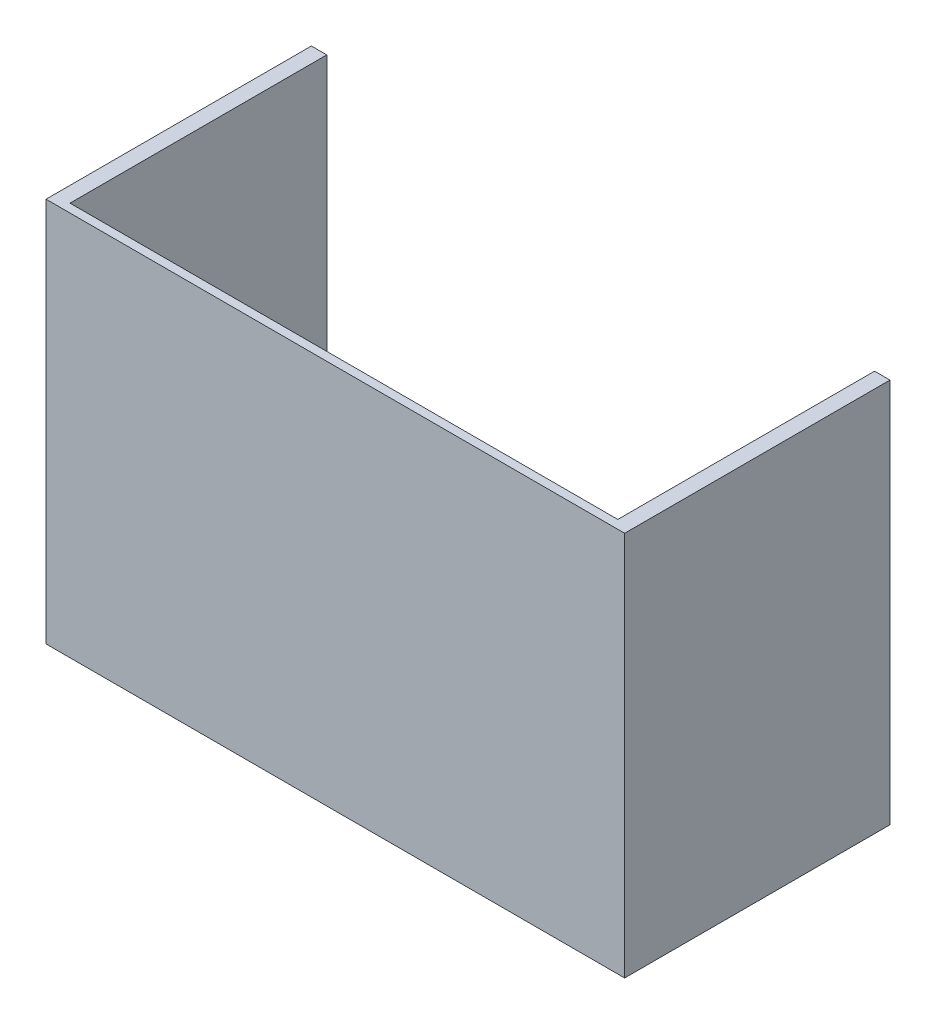
ISO-10303-21;
HEADER;
FILE_DESCRIPTION(('STEP AP214'),'2;1');
FILE_NAME('part.step','',(''),(''),'','','');
FILE_SCHEMA(('AUTOMOTIVE_DESIGN { 1 0 10303 214 1 1 1 1 }'));
ENDSEC;
DATA;
#1=APPLICATION_CONTEXT('core data for automotive mechanical design processes');
#2=APPLICATION_PROTOCOL_DEFINITION('international standard','automotive_design',2000,#1);
#3=PRODUCT_CONTEXT('',#1,'mechanical');
#4=PRODUCT('Part','Part','',(#3));
#5=PRODUCT_RELATED_PRODUCT_CATEGORY('part','',(#4));
#6=PRODUCT_DEFINITION_FORMATION('','',#4);
#7=PRODUCT_DEFINITION_CONTEXT('part definition',#1,'design');
#8=PRODUCT_DEFINITION('design','',#6,#7);
#9=PRODUCT_DEFINITION_SHAPE('','',#8);
#10=(LENGTH_UNIT() NAMED_UNIT(*) SI_UNIT(.MILLI.,.METRE.));
#11=(NAMED_UNIT(*) PLANE_ANGLE_UNIT() SI_UNIT($,.RADIAN.));
#12=(NAMED_UNIT(*) SI_UNIT($,.STERADIAN.) SOLID_ANGLE_UNIT());
#13=UNCERTAINTY_MEASURE_WITH_UNIT(LENGTH_MEASURE(1.E-05),#10,'distance_accuracy_value','');
#14=(GEOMETRIC_REPRESENTATION_CONTEXT(3) GLOBAL_UNCERTAINTY_ASSIGNED_CONTEXT((#13)) GLOBAL_UNIT_ASSIGNED_CONTEXT((#10,
#11,#12)) REPRESENTATION_CONTEXT('',''));
#15=CARTESIAN_POINT('',(0.,0.,0.));
#16=DIRECTION('',(0.,0.,1.));
#17=DIRECTION('',(1.,0.,0.));
#18=AXIS2_PLACEMENT_3D('',#15,#16,#17);
#19=CARTESIAN_POINT('',(-195.2,35.6309204037054,12.9999999999999));
#20=DIRECTION('',(-1.,0.,0.));
#21=DIRECTION('',(0.,-1.,0.));
#22=AXIS2_PLACEMENT_3D('',#19,#20,#21);
#23=PLANE('',#22);
#24=DIRECTION('',(0.,0.,1.));
#25=VECTOR('',#24,1.);
#26=CARTESIAN_POINT('',(-195.2,110.,12.9999999999998));
#27=LINE('',#26,#25);
#28=CARTESIAN_POINT('',(-195.2,110.,12.9999999999998));
#29=VERTEX_POINT('',#28);
#30=CARTESIAN_POINT('',(-195.2,110.,43.9999999999998));
#31=VERTEX_POINT('',#30);
#32=EDGE_CURVE('E35',#29,#31,#27,.T.);
#33=ORIENTED_EDGE('',*,*,#32,.F.);
#34=DIRECTION('',(0.,1.,0.));
#35=VECTOR('',#34,1.);
#36=CARTESIAN_POINT('',(-195.2,35.6309204037054,12.9999999999999));
#37=LINE('',#36,#35);
#38=CARTESIAN_POINT('',(-195.2,155.,12.9999999999998));
#39=VERTEX_POINT('',#38);
#40=EDGE_CURVE('E116',#29,#39,#37,.T.);
#41=ORIENTED_EDGE('',*,*,#40,.T.);
#42=DIRECTION('',(0.,0.,1.));
#43=VECTOR('',#42,1.);
#44=CARTESIAN_POINT('',(-195.2,155.,12.9999999999998));
#45=LINE('',#44,#43);
#46=CARTESIAN_POINT('',(-195.2,155.,43.9999999999998));
#47=VERTEX_POINT('',#46);
#48=EDGE_CURVE('E110',#39,#47,#45,.T.);
#49=ORIENTED_EDGE('',*,*,#48,.T.);
#50=DIRECTION('',(0.,1.,0.));
#51=VECTOR('',#50,1.);
#52=CARTESIAN_POINT('',(-195.2,35.6309204037054,43.9999999999999));
#53=LINE('',#52,#51);
#54=EDGE_CURVE('E95',#31,#47,#53,.T.);
#55=ORIENTED_EDGE('',*,*,#54,.F.);
#56=EDGE_LOOP('',(#33,#41,#49,#55));
#57=FACE_BOUND('',#56,.T.);
#58=ADVANCED_FACE('F32',(#57),#23,.F.);
#59=CARTESIAN_POINT('',(-195.2,35.6309204037054,43.9999999999999));
#60=DIRECTION('',(0.,0.,-1.));
#61=DIRECTION('',(0.,1.,0.));
#62=AXIS2_PLACEMENT_3D('',#59,#60,#61);
#63=PLANE('',#62);
#64=DIRECTION('',(-1.,0.,0.));
#65=VECTOR('',#64,1.);
#66=CARTESIAN_POINT('',(-195.2,110.,43.9999999999999));
#67=LINE('',#66,#65);
#68=CARTESIAN_POINT('',(-262.8,110.,43.9999999999998));
#69=VERTEX_POINT('',#68);
#70=EDGE_CURVE('E58',#31,#69,#67,.T.);
#71=ORIENTED_EDGE('',*,*,#70,.F.);
#72=ORIENTED_EDGE('',*,*,#54,.T.);
#73=DIRECTION('',(-1.,0.,0.));
#74=VECTOR('',#73,1.);
#75=CARTESIAN_POINT('',(-195.2,155.,43.9999999999998));
#76=LINE('',#75,#74);
#77=CARTESIAN_POINT('',(-262.8,155.,43.9999999999998));
#78=VERTEX_POINT('',#77);
#79=EDGE_CURVE('E99',#47,#78,#76,.T.);
#80=ORIENTED_EDGE('',*,*,#79,.T.);
#81=DIRECTION('',(0.,1.,0.));
#82=VECTOR('',#81,1.);
#83=CARTESIAN_POINT('',(-262.8,35.6309204037054,43.9999999999999));
#84=LINE('',#83,#82);
#85=EDGE_CURVE('E104',#69,#78,#84,.T.);
#86=ORIENTED_EDGE('',*,*,#85,.F.);
#87=EDGE_LOOP('',(#71,#72,#80,#86));
#88=FACE_BOUND('',#87,.T.);
#89=ADVANCED_FACE('F97',(#88),#63,.F.);
#90=CARTESIAN_POINT('',(-262.8,35.6309204037053,12.9999999999999));
#91=DIRECTION('',(1.,0.,0.));
#92=DIRECTION('',(0.,1.,0.));
#93=AXIS2_PLACEMENT_3D('',#90,#91,#92);
#94=PLANE('',#93);
#95=DIRECTION('',(0.,0.,-1.));
#96=VECTOR('',#95,1.);
#97=CARTESIAN_POINT('',(-262.8,110.,12.9999999999998));
#98=LINE('',#97,#96);
#99=CARTESIAN_POINT('',(-262.8,110.,12.9999999999998));
#100=VERTEX_POINT('',#99);
#101=EDGE_CURVE('E154',#69,#100,#98,.T.);
#102=ORIENTED_EDGE('',*,*,#101,.F.);
#103=ORIENTED_EDGE('',*,*,#85,.T.);
#104=DIRECTION('',(0.,0.,-1.));
#105=VECTOR('',#104,1.);
#106=CARTESIAN_POINT('',(-262.8,155.,12.9999999999998));
#107=LINE('',#106,#105);
#108=CARTESIAN_POINT('',(-262.8,155.,12.9999999999998));
#109=VERTEX_POINT('',#108);
#110=EDGE_CURVE('E113',#78,#109,#107,.T.);
#111=ORIENTED_EDGE('',*,*,#110,.T.);
#112=DIRECTION('',(0.,1.,0.));
#113=VECTOR('',#112,1.);
#114=CARTESIAN_POINT('',(-262.8,35.6309204037053,12.9999999999999));
#115=LINE('',#114,#113);
#116=EDGE_CURVE('E144',#100,#109,#115,.T.);
#117=ORIENTED_EDGE('',*,*,#116,.F.);
#118=EDGE_LOOP('',(#102,#103,#111,#117));
#119=FACE_BOUND('',#118,.T.);
#120=ADVANCED_FACE('F161',(#119),#94,.F.);
#121=CARTESIAN_POINT('',(-261.,35.6309204037053,12.9999999999999));
#122=DIRECTION('',(0.,0.,1.));
#123=DIRECTION('',(1.,0.,0.));
#124=AXIS2_PLACEMENT_3D('',#121,#122,#123);
#125=PLANE('',#124);
#126=DIRECTION('',(1.,0.,0.));
#127=VECTOR('',#126,1.);
#128=CARTESIAN_POINT('',(-261.,110.,12.9999999999999));
#129=LINE('',#128,#127);
#130=CARTESIAN_POINT('',(-261.,110.,12.9999999999998));
#131=VERTEX_POINT('',#130);
#132=EDGE_CURVE('E48',#100,#131,#129,.T.);
#133=ORIENTED_EDGE('',*,*,#132,.F.);
#134=ORIENTED_EDGE('',*,*,#116,.T.);
#135=DIRECTION('',(1.,0.,0.));
#136=VECTOR('',#135,1.);
#137=CARTESIAN_POINT('',(-261.,155.,12.9999999999998));
#138=LINE('',#137,#136);
#139=CARTESIAN_POINT('',(-261.,155.,12.9999999999998));
#140=VERTEX_POINT('',#139);
#141=EDGE_CURVE('E121',#109,#140,#138,.T.);
#142=ORIENTED_EDGE('',*,*,#141,.T.);
#143=DIRECTION('',(0.,1.,0.));
#144=VECTOR('',#143,1.);
#145=CARTESIAN_POINT('',(-261.,35.6309204037053,12.9999999999999));
#146=LINE('',#145,#144);
#147=EDGE_CURVE('E142',#131,#140,#146,.T.);
#148=ORIENTED_EDGE('',*,*,#147,.F.);
#149=EDGE_LOOP('',(#133,#134,#142,#148));
#150=FACE_BOUND('',#149,.T.);
#151=ADVANCED_FACE('F160',(#150),#125,.F.);
#152=CARTESIAN_POINT('',(-261.,35.6309204037053,12.9999999999999));
#153=DIRECTION('',(-1.,0.,0.));
#154=DIRECTION('',(0.,-1.,0.));
#155=AXIS2_PLACEMENT_3D('',#152,#153,#154);
#156=PLANE('',#155);
#157=DIRECTION('',(0.,0.,1.));
#158=VECTOR('',#157,1.);
#159=CARTESIAN_POINT('',(-261.,110.,12.9999999999998));
#160=LINE('',#159,#158);
#161=CARTESIAN_POINT('',(-261.,110.,42.9999999999998));
#162=VERTEX_POINT('',#161);
#163=EDGE_CURVE('E151',#131,#162,#160,.T.);
#164=ORIENTED_EDGE('',*,*,#163,.F.);
#165=ORIENTED_EDGE('',*,*,#147,.T.);
#166=DIRECTION('',(0.,0.,1.));
#167=VECTOR('',#166,1.);
#168=CARTESIAN_POINT('',(-261.,155.,12.9999999999998));
#169=LINE('',#168,#167);
#170=CARTESIAN_POINT('',(-261.,155.,42.9999999999998));
#171=VERTEX_POINT('',#170);
#172=EDGE_CURVE('E124',#140,#171,#169,.T.);
#173=ORIENTED_EDGE('',*,*,#172,.T.);
#174=DIRECTION('',(0.,1.,0.));
#175=VECTOR('',#174,1.);
#176=CARTESIAN_POINT('',(-261.,35.6309204037054,42.9999999999999));
#177=LINE('',#176,#175);
#178=EDGE_CURVE('E140',#162,#171,#177,.T.);
#179=ORIENTED_EDGE('',*,*,#178,.F.);
#180=EDGE_LOOP('',(#164,#165,#173,#179));
#181=FACE_BOUND('',#180,.T.);
#182=ADVANCED_FACE('F167',(#181),#156,.F.);
#183=CARTESIAN_POINT('',(-197.,35.6309204037054,42.9999999999999));
#184=DIRECTION('',(0.,0.,1.));
#185=DIRECTION('',(0.,-1.,0.));
#186=AXIS2_PLACEMENT_3D('',#183,#184,#185);
#187=PLANE('',#186);
#188=DIRECTION('',(1.,0.,0.));
#189=VECTOR('',#188,1.);
#190=CARTESIAN_POINT('',(-197.,110.,42.9999999999999));
#191=LINE('',#190,#189);
#192=CARTESIAN_POINT('',(-197.,110.,42.9999999999998));
#193=VERTEX_POINT('',#192);
#194=EDGE_CURVE('E148',#162,#193,#191,.T.);
#195=ORIENTED_EDGE('',*,*,#194,.F.);
#196=ORIENTED_EDGE('',*,*,#178,.T.);
#197=DIRECTION('',(1.,0.,0.));
#198=VECTOR('',#197,1.);
#199=CARTESIAN_POINT('',(-197.,155.,42.9999999999998));
#200=LINE('',#199,#198);
#201=CARTESIAN_POINT('',(-197.,155.,42.9999999999998));
#202=VERTEX_POINT('',#201);
#203=EDGE_CURVE('E127',#171,#202,#200,.T.);
#204=ORIENTED_EDGE('',*,*,#203,.T.);
#205=DIRECTION('',(0.,1.,0.));
#206=VECTOR('',#205,1.);
#207=CARTESIAN_POINT('',(-197.,35.6309204037054,42.9999999999999));
#208=LINE('',#207,#206);
#209=EDGE_CURVE('E138',#193,#202,#208,.T.);
#210=ORIENTED_EDGE('',*,*,#209,.F.);
#211=EDGE_LOOP('',(#195,#196,#204,#210));
#212=FACE_BOUND('',#211,.T.);
#213=ADVANCED_FACE('F172',(#212),#187,.F.);
#214=CARTESIAN_POINT('',(-197.,35.6309204037054,12.9999999999999));
#215=DIRECTION('',(1.,0.,0.));
#216=DIRECTION('',(0.,1.,0.));
#217=AXIS2_PLACEMENT_3D('',#214,#215,#216);
#218=PLANE('',#217);
#219=DIRECTION('',(0.,0.,-1.));
#220=VECTOR('',#219,1.);
#221=CARTESIAN_POINT('',(-197.,110.,12.9999999999998));
#222=LINE('',#221,#220);
#223=CARTESIAN_POINT('',(-197.,110.,12.9999999999999));
#224=VERTEX_POINT('',#223);
#225=EDGE_CURVE('E103',#193,#224,#222,.T.);
#226=ORIENTED_EDGE('',*,*,#225,.F.);
#227=ORIENTED_EDGE('',*,*,#209,.T.);
#228=DIRECTION('',(0.,0.,-1.));
#229=VECTOR('',#228,1.);
#230=CARTESIAN_POINT('',(-197.,155.,12.9999999999998));
#231=LINE('',#230,#229);
#232=CARTESIAN_POINT('',(-197.,155.,12.9999999999998));
#233=VERTEX_POINT('',#232);
#234=EDGE_CURVE('E130',#202,#233,#231,.T.);
#235=ORIENTED_EDGE('',*,*,#234,.T.);
#236=DIRECTION('',(0.,1.,0.));
#237=VECTOR('',#236,1.);
#238=CARTESIAN_POINT('',(-197.,35.6309204037054,12.9999999999999));
#239=LINE('',#238,#237);
#240=EDGE_CURVE('E136',#224,#233,#239,.T.);
#241=ORIENTED_EDGE('',*,*,#240,.F.);
#242=EDGE_LOOP('',(#226,#227,#235,#241));
#243=FACE_BOUND('',#242,.T.);
#244=ADVANCED_FACE('F174',(#243),#218,.F.);
#245=CARTESIAN_POINT('',(-195.2,35.6309204037054,12.9999999999999));
#246=DIRECTION('',(0.,0.,1.));
#247=DIRECTION('',(0.,-1.,0.));
#248=AXIS2_PLACEMENT_3D('',#245,#246,#247);
#249=PLANE('',#248);
#250=DIRECTION('',(1.,0.,0.));
#251=VECTOR('',#250,1.);
#252=CARTESIAN_POINT('',(-195.2,110.,12.9999999999999));
#253=LINE('',#252,#251);
#254=EDGE_CURVE('E11',#224,#29,#253,.T.);
#255=ORIENTED_EDGE('',*,*,#254,.F.);
#256=ORIENTED_EDGE('',*,*,#240,.T.);
#257=DIRECTION('',(1.,0.,0.));
#258=VECTOR('',#257,1.);
#259=CARTESIAN_POINT('',(-195.2,155.,12.9999999999998));
#260=LINE('',#259,#258);
#261=EDGE_CURVE('E133',#233,#39,#260,.T.);
#262=ORIENTED_EDGE('',*,*,#261,.T.);
#263=ORIENTED_EDGE('',*,*,#40,.F.);
#264=EDGE_LOOP('',(#255,#256,#262,#263));
#265=FACE_BOUND('',#264,.T.);
#266=ADVANCED_FACE('F178',(#265),#249,.F.);
#267=CARTESIAN_POINT('',(0.,155.,-1.38777878078145E-13));
#268=DIRECTION('',(0.,-1.,0.));
#269=DIRECTION('',(0.,0.,-1.));
#270=AXIS2_PLACEMENT_3D('',#267,#268,#269);
#271=PLANE('',#270);
#272=ORIENTED_EDGE('',*,*,#48,.F.);
#273=ORIENTED_EDGE('',*,*,#261,.F.);
#274=ORIENTED_EDGE('',*,*,#234,.F.);
#275=ORIENTED_EDGE('',*,*,#203,.F.);
#276=ORIENTED_EDGE('',*,*,#172,.F.);
#277=ORIENTED_EDGE('',*,*,#141,.F.);
#278=ORIENTED_EDGE('',*,*,#110,.F.);
#279=ORIENTED_EDGE('',*,*,#79,.F.);
#280=EDGE_LOOP('',(#272,#273,#274,#275,#276,#277,#278,#279));
#281=FACE_BOUND('',#280,.T.);
#282=ADVANCED_FACE('F108',(#281),#271,.F.);
#283=CARTESIAN_POINT('',(-74.6335718260684,110.,7.99999999999983));
#284=DIRECTION('',(0.,-1.,0.));
#285=DIRECTION('',(0.,0.,1.));
#286=AXIS2_PLACEMENT_3D('',#283,#284,#285);
#287=PLANE('',#286);
#288=ORIENTED_EDGE('',*,*,#132,.T.);
#289=ORIENTED_EDGE('',*,*,#163,.T.);
#290=ORIENTED_EDGE('',*,*,#194,.T.);
#291=ORIENTED_EDGE('',*,*,#225,.T.);
#292=ORIENTED_EDGE('',*,*,#254,.T.);
#293=ORIENTED_EDGE('',*,*,#32,.T.);
#294=ORIENTED_EDGE('',*,*,#70,.T.);
#295=ORIENTED_EDGE('',*,*,#101,.T.);
#296=EDGE_LOOP('',(#288,#289,#290,#291,#292,#293,#294,#295));
#297=FACE_BOUND('',#296,.T.);
#298=ADVANCED_FACE('F155',(#297),#287,.T.);
#299=CLOSED_SHELL('',(#58,#89,#120,#151,#182,#213,#244,#266,#282,#298));
#300=MANIFOLD_SOLID_BREP('B2',#299);
#301=ADVANCED_BREP_SHAPE_REPRESENTATION('',(#18,#300),#14);
#302=SHAPE_DEFINITION_REPRESENTATION(#9,#301);
ENDSEC;
END-ISO-10303-21;
